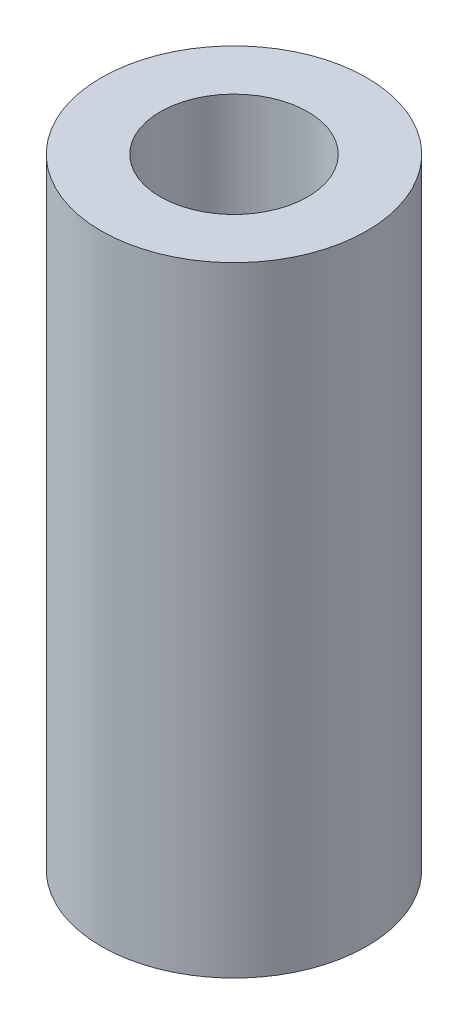
ISO-10303-21;
HEADER;
FILE_DESCRIPTION(('STEP AP214'),'2;1');
FILE_NAME('part.step','',(''),(''),'','','');
FILE_SCHEMA(('AUTOMOTIVE_DESIGN { 1 0 10303 214 1 1 1 1 }'));
ENDSEC;
DATA;
#1=APPLICATION_CONTEXT('core data for automotive mechanical design processes');
#2=APPLICATION_PROTOCOL_DEFINITION('international standard','automotive_design',2000,#1);
#3=PRODUCT_CONTEXT('',#1,'mechanical');
#4=PRODUCT('Part','Part','',(#3));
#5=PRODUCT_RELATED_PRODUCT_CATEGORY('part','',(#4));
#6=PRODUCT_DEFINITION_FORMATION('','',#4);
#7=PRODUCT_DEFINITION_CONTEXT('part definition',#1,'design');
#8=PRODUCT_DEFINITION('design','',#6,#7);
#9=PRODUCT_DEFINITION_SHAPE('','',#8);
#10=(LENGTH_UNIT() NAMED_UNIT(*) SI_UNIT(.MILLI.,.METRE.));
#11=(NAMED_UNIT(*) PLANE_ANGLE_UNIT() SI_UNIT($,.RADIAN.));
#12=(NAMED_UNIT(*) SI_UNIT($,.STERADIAN.) SOLID_ANGLE_UNIT());
#13=UNCERTAINTY_MEASURE_WITH_UNIT(LENGTH_MEASURE(1.E-05),#10,'distance_accuracy_value','');
#14=(GEOMETRIC_REPRESENTATION_CONTEXT(3) GLOBAL_UNCERTAINTY_ASSIGNED_CONTEXT((#13)) GLOBAL_UNIT_ASSIGNED_CONTEXT((#10,
#11,#12)) REPRESENTATION_CONTEXT('',''));
#15=CARTESIAN_POINT('',(0.,0.,0.));
#16=DIRECTION('',(0.,0.,1.));
#17=DIRECTION('',(1.,0.,0.));
#18=AXIS2_PLACEMENT_3D('',#15,#16,#17);
#19=CARTESIAN_POINT('',(0.,10.5,0.));
#20=DIRECTION('',(0.,-1.,0.));
#21=DIRECTION('',(0.,0.,-1.));
#22=AXIS2_PLACEMENT_3D('',#19,#20,#21);
#23=CYLINDRICAL_SURFACE('',#22,2.25);
#24=CARTESIAN_POINT('',(0.,10.5,0.));
#25=DIRECTION('',(0.,1.,0.));
#26=DIRECTION('',(0.,0.,1.));
#27=AXIS2_PLACEMENT_3D('',#24,#25,#26);
#28=CIRCLE('',#27,2.25);
#29=CARTESIAN_POINT('',(0.,10.5,-2.25));
#30=VERTEX_POINT('',#29);
#31=EDGE_CURVE('E10',#30,#30,#28,.T.);
#32=CARTESIAN_POINT('',(0.,0.,0.));
#33=DIRECTION('',(0.,1.,0.));
#34=DIRECTION('',(0.,0.,1.));
#35=AXIS2_PLACEMENT_3D('',#32,#33,#34);
#36=CIRCLE('',#35,2.25);
#37=CARTESIAN_POINT('',(0.,0.,-2.25));
#38=VERTEX_POINT('',#37);
#39=EDGE_CURVE('E34',#38,#38,#36,.T.);
#40=CARTESIAN_POINT('',(0.,10.5,-2.25));
#41=CARTESIAN_POINT('',(0.,10.390625,-2.25));
#42=CARTESIAN_POINT('',(0.,10.28125,-2.25));
#43=CARTESIAN_POINT('',(0.,10.0625,-2.25));
#44=CARTESIAN_POINT('',(0.,9.953125,-2.25));
#45=CARTESIAN_POINT('',(0.,9.734375,-2.25));
#46=CARTESIAN_POINT('',(0.,9.625,-2.25));
#47=CARTESIAN_POINT('',(0.,9.40625,-2.25));
#48=CARTESIAN_POINT('',(0.,9.296875,-2.25));
#49=CARTESIAN_POINT('',(0.,9.078125,-2.25));
#50=CARTESIAN_POINT('',(0.,8.96875,-2.25));
#51=CARTESIAN_POINT('',(0.,8.75,-2.25));
#52=CARTESIAN_POINT('',(0.,8.640625,-2.25));
#53=CARTESIAN_POINT('',(0.,8.421875,-2.25));
#54=CARTESIAN_POINT('',(0.,8.3125,-2.25));
#55=CARTESIAN_POINT('',(0.,8.09375,-2.25));
#56=CARTESIAN_POINT('',(0.,7.984375,-2.25));
#57=CARTESIAN_POINT('',(0.,7.765625,-2.25));
#58=CARTESIAN_POINT('',(0.,7.65625,-2.25));
#59=CARTESIAN_POINT('',(0.,7.4375,-2.25));
#60=CARTESIAN_POINT('',(0.,7.328125,-2.25));
#61=CARTESIAN_POINT('',(0.,7.109375,-2.25));
#62=CARTESIAN_POINT('',(0.,7.,-2.25));
#63=CARTESIAN_POINT('',(0.,6.78125,-2.25));
#64=CARTESIAN_POINT('',(0.,6.671875,-2.25));
#65=CARTESIAN_POINT('',(0.,6.453125,-2.25));
#66=CARTESIAN_POINT('',(0.,6.34375,-2.25));
#67=CARTESIAN_POINT('',(0.,6.125,-2.25));
#68=CARTESIAN_POINT('',(0.,6.015625,-2.25));
#69=CARTESIAN_POINT('',(0.,5.796875,-2.25));
#70=CARTESIAN_POINT('',(0.,5.6875,-2.25));
#71=CARTESIAN_POINT('',(0.,5.46875,-2.25));
#72=CARTESIAN_POINT('',(0.,5.359375,-2.25));
#73=CARTESIAN_POINT('',(0.,5.140625,-2.25));
#74=CARTESIAN_POINT('',(0.,5.03125,-2.25));
#75=CARTESIAN_POINT('',(0.,4.8125,-2.25));
#76=CARTESIAN_POINT('',(0.,4.703125,-2.25));
#77=CARTESIAN_POINT('',(0.,4.484375,-2.25));
#78=CARTESIAN_POINT('',(0.,4.375,-2.25));
#79=CARTESIAN_POINT('',(0.,4.15625,-2.25));
#80=CARTESIAN_POINT('',(0.,4.046875,-2.25));
#81=CARTESIAN_POINT('',(0.,3.828125,-2.25));
#82=CARTESIAN_POINT('',(0.,3.71875,-2.25));
#83=CARTESIAN_POINT('',(0.,3.5,-2.25));
#84=CARTESIAN_POINT('',(0.,3.390625,-2.25));
#85=CARTESIAN_POINT('',(0.,3.171875,-2.25));
#86=CARTESIAN_POINT('',(0.,3.0625,-2.25));
#87=CARTESIAN_POINT('',(0.,2.84375,-2.25));
#88=CARTESIAN_POINT('',(0.,2.734375,-2.25));
#89=CARTESIAN_POINT('',(0.,2.515625,-2.25));
#90=CARTESIAN_POINT('',(0.,2.40625,-2.25));
#91=CARTESIAN_POINT('',(0.,2.1875,-2.25));
#92=CARTESIAN_POINT('',(0.,2.078125,-2.25));
#93=CARTESIAN_POINT('',(0.,1.859375,-2.25));
#94=CARTESIAN_POINT('',(0.,1.75,-2.25));
#95=CARTESIAN_POINT('',(0.,1.53125,-2.25));
#96=CARTESIAN_POINT('',(0.,1.421875,-2.25));
#97=CARTESIAN_POINT('',(0.,1.203125,-2.25));
#98=CARTESIAN_POINT('',(0.,1.09375,-2.25));
#99=CARTESIAN_POINT('',(0.,0.875000000000001,-2.25));
#100=CARTESIAN_POINT('',(0.,0.765625000000001,-2.25));
#101=CARTESIAN_POINT('',(0.,0.546875,-2.25));
#102=CARTESIAN_POINT('',(0.,0.4375,-2.25));
#103=CARTESIAN_POINT('',(0.,0.21875,-2.25));
#104=CARTESIAN_POINT('',(0.,0.109375,-2.25));
#105=CARTESIAN_POINT('',(0.,0.,-2.25));
#106=B_SPLINE_CURVE_WITH_KNOTS('',3,(#40,#41,#42,#43,#44,#45,#46,#47,#48,#49,#50,#51,#52,#53,
#54,#55,#56,#57,#58,#59,#60,#61,#62,#63,#64,#65,#66,#67,#68,#69,#70,#71,#72,#73,#74,#75,#76,#77,
#78,#79,#80,#81,#82,#83,#84,#85,#86,#87,#88,#89,#90,#91,#92,#93,#94,#95,#96,#97,#98,#99,#100,
#101,#102,#103,#104,#105),.UNSPECIFIED.,.F.,.F.,(4,2,2,2,2,2,2,2,2,2,2,2,2,2,2,2,2,2,2,2,2,2,2,
2,2,2,2,2,2,2,2,2,4),(0.,0.328125,0.656250000000001,0.984375000000001,1.3125,1.640625,1.96875,
2.296875,2.625,2.953125,3.28125,3.609375,3.9375,4.265625,4.59375,4.921875,5.25,5.578125,5.90625,
6.234375,6.5625,6.890625,7.21875,7.546875,7.875,8.203125,8.53125,8.859375,9.1875,9.515625,
9.84375,10.171875,10.5),.UNSPECIFIED.);
#107=EDGE_CURVE('BSEAM31',#30,#38,#106,.T.);
#108=ORIENTED_EDGE('',*,*,#31,.F.);
#109=ORIENTED_EDGE('',*,*,#39,.T.);
#110=ORIENTED_EDGE('',*,*,#107,.T.);
#111=ORIENTED_EDGE('',*,*,#107,.F.);
#112=EDGE_LOOP('',(#108,#110,#109,#111));
#113=FACE_BOUND('',#112,.T.);
#114=ADVANCED_FACE('F31',(#113),#23,.T.);
#115=CARTESIAN_POINT('',(0.,10.5,0.));
#116=DIRECTION('',(0.,1.,0.));
#117=DIRECTION('',(0.,0.,1.));
#118=AXIS2_PLACEMENT_3D('',#115,#116,#117);
#119=PLANE('',#118);
#120=CARTESIAN_POINT('',(0.,10.5,0.));
#121=DIRECTION('',(0.,1.,0.));
#122=DIRECTION('',(0.,0.,1.));
#123=AXIS2_PLACEMENT_3D('',#120,#121,#122);
#124=CIRCLE('',#123,1.25);
#125=CARTESIAN_POINT('',(0.,10.5,1.25));
#126=VERTEX_POINT('',#125);
#127=EDGE_CURVE('E45',#126,#126,#124,.T.);
#128=ORIENTED_EDGE('',*,*,#127,.F.);
#129=EDGE_LOOP('',(#128));
#130=FACE_BOUND('',#129,.T.);
#131=ORIENTED_EDGE('',*,*,#31,.T.);
#132=EDGE_LOOP('',(#131));
#133=FACE_BOUND('',#132,.T.);
#134=ADVANCED_FACE('F52',(#130,#133),#119,.T.);
#135=CARTESIAN_POINT('',(0.,0.,0.));
#136=DIRECTION('',(0.,1.,0.));
#137=DIRECTION('',(0.,0.,1.));
#138=AXIS2_PLACEMENT_3D('',#135,#136,#137);
#139=PLANE('',#138);
#140=CARTESIAN_POINT('',(0.,0.,0.));
#141=DIRECTION('',(0.,1.,0.));
#142=DIRECTION('',(0.,0.,1.));
#143=AXIS2_PLACEMENT_3D('',#140,#141,#142);
#144=CIRCLE('',#143,1.25);
#145=CARTESIAN_POINT('',(0.,0.,1.25));
#146=VERTEX_POINT('',#145);
#147=EDGE_CURVE('E41',#146,#146,#144,.F.);
#148=ORIENTED_EDGE('',*,*,#147,.F.);
#149=EDGE_LOOP('',(#148));
#150=FACE_BOUND('',#149,.T.);
#151=ORIENTED_EDGE('',*,*,#39,.F.);
#152=EDGE_LOOP('',(#151));
#153=FACE_BOUND('',#152,.T.);
#154=ADVANCED_FACE('F54',(#150,#153),#139,.F.);
#155=CARTESIAN_POINT('',(0.,-0.000999999999999265,0.));
#156=DIRECTION('',(0.,1.,0.));
#157=DIRECTION('',(0.,0.,1.));
#158=AXIS2_PLACEMENT_3D('',#155,#156,#157);
#159=CYLINDRICAL_SURFACE('',#158,1.25);
#160=ORIENTED_EDGE('',*,*,#127,.T.);
#161=EDGE_LOOP('',(#160));
#162=FACE_BOUND('',#161,.T.);
#163=ORIENTED_EDGE('',*,*,#147,.T.);
#164=EDGE_LOOP('',(#163));
#165=FACE_BOUND('',#164,.T.);
#166=ADVANCED_FACE('F49',(#162,#165),#159,.F.);
#167=CLOSED_SHELL('',(#114,#134,#154,#166));
#168=MANIFOLD_SOLID_BREP('B2',#167);
#169=ADVANCED_BREP_SHAPE_REPRESENTATION('',(#18,#168),#14);
#170=SHAPE_DEFINITION_REPRESENTATION(#9,#169);
ENDSEC;
END-ISO-10303-21;
